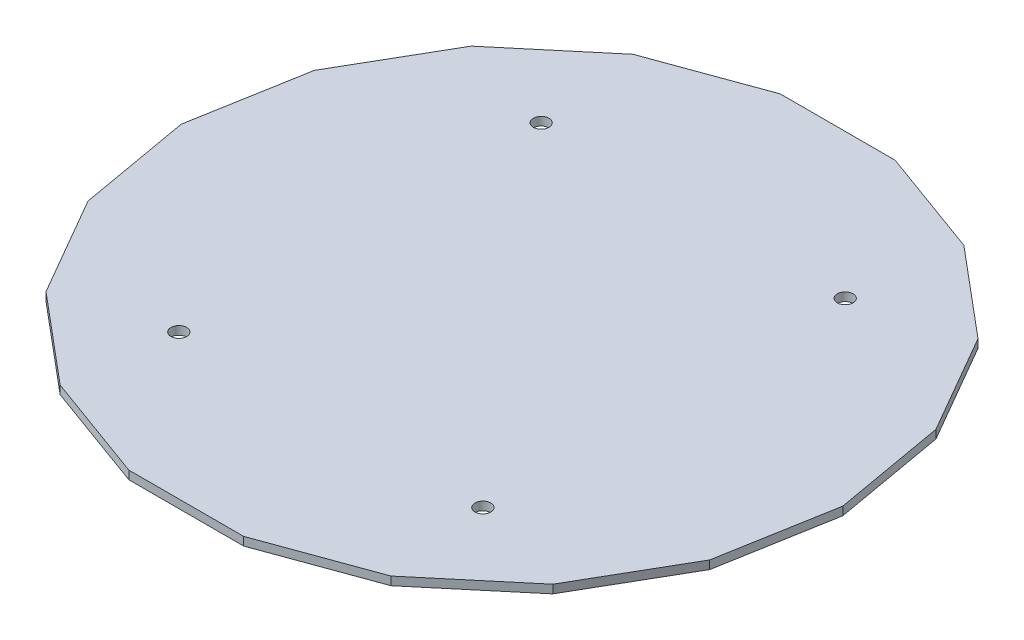
ISO-10303-21;
HEADER;
FILE_DESCRIPTION(('STEP AP214'),'2;1');
FILE_NAME('part.step','',(''),(''),'','','');
FILE_SCHEMA(('AUTOMOTIVE_DESIGN { 1 0 10303 214 1 1 1 1 }'));
ENDSEC;
DATA;
#1=APPLICATION_CONTEXT('core data for automotive mechanical design processes');
#2=APPLICATION_PROTOCOL_DEFINITION('international standard','automotive_design',2000,#1);
#3=PRODUCT_CONTEXT('',#1,'mechanical');
#4=PRODUCT('Part','Part','',(#3));
#5=PRODUCT_RELATED_PRODUCT_CATEGORY('part','',(#4));
#6=PRODUCT_DEFINITION_FORMATION('','',#4);
#7=PRODUCT_DEFINITION_CONTEXT('part definition',#1,'design');
#8=PRODUCT_DEFINITION('design','',#6,#7);
#9=PRODUCT_DEFINITION_SHAPE('','',#8);
#10=(LENGTH_UNIT() NAMED_UNIT(*) SI_UNIT(.MILLI.,.METRE.));
#11=(NAMED_UNIT(*) PLANE_ANGLE_UNIT() SI_UNIT($,.RADIAN.));
#12=(NAMED_UNIT(*) SI_UNIT($,.STERADIAN.) SOLID_ANGLE_UNIT());
#13=UNCERTAINTY_MEASURE_WITH_UNIT(LENGTH_MEASURE(1.E-05),#10,'distance_accuracy_value','');
#14=(GEOMETRIC_REPRESENTATION_CONTEXT(3) GLOBAL_UNCERTAINTY_ASSIGNED_CONTEXT((#13)) GLOBAL_UNIT_ASSIGNED_CONTEXT((#10,
#11,#12)) REPRESENTATION_CONTEXT('',''));
#15=CARTESIAN_POINT('',(0.,0.,0.));
#16=DIRECTION('',(0.,0.,1.));
#17=DIRECTION('',(1.,0.,0.));
#18=AXIS2_PLACEMENT_3D('',#15,#16,#17);
#19=CARTESIAN_POINT('',(59.2006351095123,1.6,21.547269029517));
#20=DIRECTION('',(-0.984807753012208,0.,-0.173648177666929));
#21=DIRECTION('',(-0.173648177666929,0.,0.984807753012208));
#22=AXIS2_PLACEMENT_3D('',#19,#20,#21);
#23=PLANE('',#22);
#24=DIRECTION('',(0.173648177666929,0.,-0.984807753012208));
#25=VECTOR('',#24,1.);
#26=CARTESIAN_POINT('',(59.2006351095123,0.,21.547269029517));
#27=LINE('',#26,#25);
#28=CARTESIAN_POINT('',(59.2006351095123,0.,21.547269029517));
#29=VERTEX_POINT('',#28);
#30=CARTESIAN_POINT('',(63.,0.,0.));
#31=VERTEX_POINT('',#30);
#32=EDGE_CURVE('E202',#29,#31,#27,.T.);
#33=ORIENTED_EDGE('',*,*,#32,.T.);
#34=DIRECTION('',(0.,-1.,0.));
#35=VECTOR('',#34,1.);
#36=CARTESIAN_POINT('',(63.,1.6,0.));
#37=LINE('',#36,#35);
#38=CARTESIAN_POINT('',(63.,1.6,0.));
#39=VERTEX_POINT('',#38);
#40=EDGE_CURVE('E11',#39,#31,#37,.T.);
#41=ORIENTED_EDGE('',*,*,#40,.F.);
#42=DIRECTION('',(0.173648177666929,0.,-0.984807753012208));
#43=VECTOR('',#42,1.);
#44=CARTESIAN_POINT('',(59.2006351095123,1.6,21.547269029517));
#45=LINE('',#44,#43);
#46=CARTESIAN_POINT('',(59.2006351095123,1.6,21.547269029517));
#47=VERTEX_POINT('',#46);
#48=EDGE_CURVE('E237',#47,#39,#45,.T.);
#49=ORIENTED_EDGE('',*,*,#48,.F.);
#50=DIRECTION('',(0.,-1.,0.));
#51=VECTOR('',#50,1.);
#52=CARTESIAN_POINT('',(59.2006351095123,1.6,21.547269029517));
#53=LINE('',#52,#51);
#54=EDGE_CURVE('E198',#47,#29,#53,.T.);
#55=ORIENTED_EDGE('',*,*,#54,.T.);
#56=EDGE_LOOP('',(#33,#41,#49,#55));
#57=FACE_BOUND('',#56,.T.);
#58=ADVANCED_FACE('F46',(#57),#23,.F.);
#59=CARTESIAN_POINT('',(63.,1.6,0.));
#60=DIRECTION('',(-0.984807753012208,0.,0.173648177666932));
#61=DIRECTION('',(0.173648177666932,0.,0.984807753012208));
#62=AXIS2_PLACEMENT_3D('',#59,#60,#61);
#63=PLANE('',#62);
#64=DIRECTION('',(-0.173648177666932,0.,-0.984807753012208));
#65=VECTOR('',#64,1.);
#66=CARTESIAN_POINT('',(63.,0.,0.));
#67=LINE('',#66,#65);
#68=CARTESIAN_POINT('',(59.2006351095122,0.,-21.5472690295172));
#69=VERTEX_POINT('',#68);
#70=EDGE_CURVE('E205',#31,#69,#67,.T.);
#71=ORIENTED_EDGE('',*,*,#70,.T.);
#72=DIRECTION('',(0.,-1.,0.));
#73=VECTOR('',#72,1.);
#74=CARTESIAN_POINT('',(59.2006351095122,1.6,-21.5472690295172));
#75=LINE('',#74,#73);
#76=CARTESIAN_POINT('',(59.2006351095122,1.6,-21.5472690295172));
#77=VERTEX_POINT('',#76);
#78=EDGE_CURVE('E54',#77,#69,#75,.T.);
#79=ORIENTED_EDGE('',*,*,#78,.F.);
#80=DIRECTION('',(-0.173648177666932,0.,-0.984807753012208));
#81=VECTOR('',#80,1.);
#82=CARTESIAN_POINT('',(63.,1.6,0.));
#83=LINE('',#82,#81);
#84=EDGE_CURVE('E135',#39,#77,#83,.T.);
#85=ORIENTED_EDGE('',*,*,#84,.F.);
#86=ORIENTED_EDGE('',*,*,#40,.T.);
#87=EDGE_LOOP('',(#71,#79,#85,#86));
#88=FACE_BOUND('',#87,.T.);
#89=ADVANCED_FACE('F346',(#88),#63,.F.);
#90=CARTESIAN_POINT('',(59.2006351095122,1.6,-21.5472690295172));
#91=DIRECTION('',(-0.866025403784437,0.,0.500000000000002));
#92=DIRECTION('',(0.500000000000002,0.,0.866025403784438));
#93=AXIS2_PLACEMENT_3D('',#90,#91,#92);
#94=PLANE('',#93);
#95=DIRECTION('',(-0.500000000000002,0.,-0.866025403784437));
#96=VECTOR('',#95,1.);
#97=CARTESIAN_POINT('',(59.2006351095122,0.,-21.5472690295172));
#98=LINE('',#97,#96);
#99=CARTESIAN_POINT('',(48.2607999164955,0.,-40.4956194102521));
#100=VERTEX_POINT('',#99);
#101=EDGE_CURVE('E208',#69,#100,#98,.T.);
#102=ORIENTED_EDGE('',*,*,#101,.T.);
#103=DIRECTION('',(0.,-1.,0.));
#104=VECTOR('',#103,1.);
#105=CARTESIAN_POINT('',(48.2607999164955,1.6,-40.4956194102521));
#106=LINE('',#105,#104);
#107=CARTESIAN_POINT('',(48.2607999164955,1.6,-40.4956194102521));
#108=VERTEX_POINT('',#107);
#109=EDGE_CURVE('E274',#108,#100,#106,.T.);
#110=ORIENTED_EDGE('',*,*,#109,.F.);
#111=DIRECTION('',(-0.500000000000002,0.,-0.866025403784437));
#112=VECTOR('',#111,1.);
#113=CARTESIAN_POINT('',(59.2006351095122,1.6,-21.5472690295172));
#114=LINE('',#113,#112);
#115=EDGE_CURVE('E282',#77,#108,#114,.T.);
#116=ORIENTED_EDGE('',*,*,#115,.F.);
#117=ORIENTED_EDGE('',*,*,#78,.T.);
#118=EDGE_LOOP('',(#102,#110,#116,#117));
#119=FACE_BOUND('',#118,.T.);
#120=ADVANCED_FACE('F280',(#119),#94,.F.);
#121=CARTESIAN_POINT('',(48.2607999164955,1.6,-40.4956194102521));
#122=DIRECTION('',(-0.642787609686538,0.,0.766044443118979));
#123=DIRECTION('',(0.766044443118979,0.,0.642787609686538));
#124=AXIS2_PLACEMENT_3D('',#121,#122,#123);
#125=PLANE('',#124);
#126=DIRECTION('',(-0.766044443118979,0.,-0.642787609686538));
#127=VECTOR('',#126,1.);
#128=CARTESIAN_POINT('',(48.2607999164955,0.,-40.4956194102521));
#129=LINE('',#128,#127);
#130=CARTESIAN_POINT('',(31.4999999999998,0.,-54.5596004384197));
#131=VERTEX_POINT('',#130);
#132=EDGE_CURVE('E210',#100,#131,#129,.T.);
#133=ORIENTED_EDGE('',*,*,#132,.T.);
#134=DIRECTION('',(0.,-1.,0.));
#135=VECTOR('',#134,1.);
#136=CARTESIAN_POINT('',(31.4999999999998,1.6,-54.5596004384197));
#137=LINE('',#136,#135);
#138=CARTESIAN_POINT('',(31.4999999999998,1.6,-54.5596004384197));
#139=VERTEX_POINT('',#138);
#140=EDGE_CURVE('E271',#139,#131,#137,.T.);
#141=ORIENTED_EDGE('',*,*,#140,.F.);
#142=DIRECTION('',(-0.766044443118979,0.,-0.642787609686538));
#143=VECTOR('',#142,1.);
#144=CARTESIAN_POINT('',(48.2607999164955,1.6,-40.4956194102521));
#145=LINE('',#144,#143);
#146=EDGE_CURVE('E300',#108,#139,#145,.T.);
#147=ORIENTED_EDGE('',*,*,#146,.F.);
#148=ORIENTED_EDGE('',*,*,#109,.T.);
#149=EDGE_LOOP('',(#133,#141,#147,#148));
#150=FACE_BOUND('',#149,.T.);
#151=ADVANCED_FACE('F291',(#150),#125,.F.);
#152=CARTESIAN_POINT('',(31.4999999999998,1.6,-54.5596004384197));
#153=DIRECTION('',(-0.342020143325667,0.,0.939692620785909));
#154=DIRECTION('',(0.939692620785909,0.,0.342020143325667));
#155=AXIS2_PLACEMENT_3D('',#152,#153,#154);
#156=PLANE('',#155);
#157=DIRECTION('',(-0.939692620785909,0.,-0.342020143325667));
#158=VECTOR('',#157,1.);
#159=CARTESIAN_POINT('',(31.4999999999998,0.,-54.5596004384197));
#160=LINE('',#159,#158);
#161=CARTESIAN_POINT('',(10.9398351930166,0.,-62.0428884397691));
#162=VERTEX_POINT('',#161);
#163=EDGE_CURVE('E212',#131,#162,#160,.T.);
#164=ORIENTED_EDGE('',*,*,#163,.T.);
#165=DIRECTION('',(0.,-1.,0.));
#166=VECTOR('',#165,1.);
#167=CARTESIAN_POINT('',(10.9398351930166,1.6,-62.0428884397691));
#168=LINE('',#167,#166);
#169=CARTESIAN_POINT('',(10.9398351930166,1.6,-62.0428884397691));
#170=VERTEX_POINT('',#169);
#171=EDGE_CURVE('E268',#170,#162,#168,.T.);
#172=ORIENTED_EDGE('',*,*,#171,.F.);
#173=DIRECTION('',(-0.939692620785909,0.,-0.342020143325667));
#174=VECTOR('',#173,1.);
#175=CARTESIAN_POINT('',(31.4999999999998,1.6,-54.5596004384197));
#176=LINE('',#175,#174);
#177=EDGE_CURVE('E297',#139,#170,#176,.T.);
#178=ORIENTED_EDGE('',*,*,#177,.F.);
#179=ORIENTED_EDGE('',*,*,#140,.T.);
#180=EDGE_LOOP('',(#164,#172,#178,#179));
#181=FACE_BOUND('',#180,.T.);
#182=ADVANCED_FACE('F295',(#181),#156,.F.);
#183=CARTESIAN_POINT('',(10.9398351930166,1.6,-62.0428884397691));
#184=DIRECTION('',(0.,0.,1.));
#185=DIRECTION('',(1.,0.,0.));
#186=AXIS2_PLACEMENT_3D('',#183,#184,#185);
#187=PLANE('',#186);
#188=DIRECTION('',(-1.,0.,0.));
#189=VECTOR('',#188,1.);
#190=CARTESIAN_POINT('',(10.9398351930166,0.,-62.0428884397691));
#191=LINE('',#190,#189);
#192=CARTESIAN_POINT('',(-10.9398351930167,0.,-62.0428884397691));
#193=VERTEX_POINT('',#192);
#194=EDGE_CURVE('E214',#162,#193,#191,.T.);
#195=ORIENTED_EDGE('',*,*,#194,.T.);
#196=DIRECTION('',(0.,-1.,0.));
#197=VECTOR('',#196,1.);
#198=CARTESIAN_POINT('',(-10.9398351930167,1.6,-62.0428884397691));
#199=LINE('',#198,#197);
#200=CARTESIAN_POINT('',(-10.9398351930167,1.6,-62.0428884397691));
#201=VERTEX_POINT('',#200);
#202=EDGE_CURVE('E265',#201,#193,#199,.T.);
#203=ORIENTED_EDGE('',*,*,#202,.F.);
#204=DIRECTION('',(-1.,0.,0.));
#205=VECTOR('',#204,1.);
#206=CARTESIAN_POINT('',(10.9398351930166,1.6,-62.0428884397691));
#207=LINE('',#206,#205);
#208=EDGE_CURVE('E299',#170,#201,#207,.T.);
#209=ORIENTED_EDGE('',*,*,#208,.F.);
#210=ORIENTED_EDGE('',*,*,#171,.T.);
#211=EDGE_LOOP('',(#195,#203,#209,#210));
#212=FACE_BOUND('',#211,.T.);
#213=ADVANCED_FACE('F359',(#212),#187,.F.);
#214=CARTESIAN_POINT('',(-10.9398351930167,1.6,-62.0428884397691));
#215=DIRECTION('',(0.342020143325671,0.,0.939692620785908));
#216=DIRECTION('',(0.939692620785908,0.,-0.342020143325671));
#217=AXIS2_PLACEMENT_3D('',#214,#215,#216);
#218=PLANE('',#217);
#219=DIRECTION('',(-0.939692620785908,0.,0.342020143325671));
#220=VECTOR('',#219,1.);
#221=CARTESIAN_POINT('',(-10.9398351930167,0.,-62.0428884397691));
#222=LINE('',#221,#220);
#223=CARTESIAN_POINT('',(-31.5000000000001,0.,-54.5596004384196));
#224=VERTEX_POINT('',#223);
#225=EDGE_CURVE('E216',#193,#224,#222,.T.);
#226=ORIENTED_EDGE('',*,*,#225,.T.);
#227=DIRECTION('',(0.,-1.,0.));
#228=VECTOR('',#227,1.);
#229=CARTESIAN_POINT('',(-31.5000000000001,1.6,-54.5596004384196));
#230=LINE('',#229,#228);
#231=CARTESIAN_POINT('',(-31.5000000000001,1.6,-54.5596004384196));
#232=VERTEX_POINT('',#231);
#233=EDGE_CURVE('E262',#232,#224,#230,.T.);
#234=ORIENTED_EDGE('',*,*,#233,.F.);
#235=DIRECTION('',(-0.939692620785908,0.,0.342020143325671));
#236=VECTOR('',#235,1.);
#237=CARTESIAN_POINT('',(-10.9398351930167,1.6,-62.0428884397691));
#238=LINE('',#237,#236);
#239=EDGE_CURVE('E302',#201,#232,#238,.T.);
#240=ORIENTED_EDGE('',*,*,#239,.F.);
#241=ORIENTED_EDGE('',*,*,#202,.T.);
#242=EDGE_LOOP('',(#226,#234,#240,#241));
#243=FACE_BOUND('',#242,.T.);
#244=ADVANCED_FACE('F362',(#243),#218,.F.);
#245=CARTESIAN_POINT('',(-31.5000000000001,1.6,-54.5596004384196));
#246=DIRECTION('',(0.642787609686541,0.,0.766044443118977));
#247=DIRECTION('',(0.766044443118977,0.,-0.642787609686541));
#248=AXIS2_PLACEMENT_3D('',#245,#246,#247);
#249=PLANE('',#248);
#250=DIRECTION('',(-0.766044443118977,0.,0.642787609686541));
#251=VECTOR('',#250,1.);
#252=CARTESIAN_POINT('',(-31.5000000000001,0.,-54.5596004384196));
#253=LINE('',#252,#251);
#254=CARTESIAN_POINT('',(-48.2607999164957,0.,-40.4956194102519));
#255=VERTEX_POINT('',#254);
#256=EDGE_CURVE('E218',#224,#255,#253,.T.);
#257=ORIENTED_EDGE('',*,*,#256,.T.);
#258=DIRECTION('',(0.,-1.,0.));
#259=VECTOR('',#258,1.);
#260=CARTESIAN_POINT('',(-48.2607999164957,1.6,-40.4956194102519));
#261=LINE('',#260,#259);
#262=CARTESIAN_POINT('',(-48.2607999164957,1.6,-40.4956194102519));
#263=VERTEX_POINT('',#262);
#264=EDGE_CURVE('E259',#263,#255,#261,.T.);
#265=ORIENTED_EDGE('',*,*,#264,.F.);
#266=DIRECTION('',(-0.766044443118977,0.,0.642787609686541));
#267=VECTOR('',#266,1.);
#268=CARTESIAN_POINT('',(-31.5000000000001,1.6,-54.5596004384196));
#269=LINE('',#268,#267);
#270=EDGE_CURVE('E308',#232,#263,#269,.T.);
#271=ORIENTED_EDGE('',*,*,#270,.F.);
#272=ORIENTED_EDGE('',*,*,#233,.T.);
#273=EDGE_LOOP('',(#257,#265,#271,#272));
#274=FACE_BOUND('',#273,.T.);
#275=ADVANCED_FACE('F366',(#274),#249,.F.);
#276=CARTESIAN_POINT('',(-48.2607999164957,1.6,-40.4956194102519));
#277=DIRECTION('',(0.86602540378444,0.,0.499999999999998));
#278=DIRECTION('',(0.499999999999998,0.,-0.86602540378444));
#279=AXIS2_PLACEMENT_3D('',#276,#277,#278);
#280=PLANE('',#279);
#281=DIRECTION('',(-0.499999999999998,0.,0.86602540378444));
#282=VECTOR('',#281,1.);
#283=CARTESIAN_POINT('',(-48.2607999164957,0.,-40.4956194102519));
#284=LINE('',#283,#282);
#285=CARTESIAN_POINT('',(-59.2006351095123,0.,-21.547269029517));
#286=VERTEX_POINT('',#285);
#287=EDGE_CURVE('E220',#255,#286,#284,.T.);
#288=ORIENTED_EDGE('',*,*,#287,.T.);
#289=DIRECTION('',(0.,-1.,0.));
#290=VECTOR('',#289,1.);
#291=CARTESIAN_POINT('',(-59.2006351095123,1.6,-21.547269029517));
#292=LINE('',#291,#290);
#293=CARTESIAN_POINT('',(-59.2006351095123,1.6,-21.547269029517));
#294=VERTEX_POINT('',#293);
#295=EDGE_CURVE('E256',#294,#286,#292,.T.);
#296=ORIENTED_EDGE('',*,*,#295,.F.);
#297=DIRECTION('',(-0.499999999999998,0.,0.86602540378444));
#298=VECTOR('',#297,1.);
#299=CARTESIAN_POINT('',(-48.2607999164957,1.6,-40.4956194102519));
#300=LINE('',#299,#298);
#301=EDGE_CURVE('E310',#263,#294,#300,.T.);
#302=ORIENTED_EDGE('',*,*,#301,.F.);
#303=ORIENTED_EDGE('',*,*,#264,.T.);
#304=EDGE_LOOP('',(#288,#296,#302,#303));
#305=FACE_BOUND('',#304,.T.);
#306=ADVANCED_FACE('F370',(#305),#280,.F.);
#307=CARTESIAN_POINT('',(-59.2006351095123,1.6,-21.547269029517));
#308=DIRECTION('',(0.984807753012208,0.,0.173648177666929));
#309=DIRECTION('',(0.173648177666929,0.,-0.984807753012208));
#310=AXIS2_PLACEMENT_3D('',#307,#308,#309);
#311=PLANE('',#310);
#312=DIRECTION('',(-0.173648177666929,0.,0.984807753012208));
#313=VECTOR('',#312,1.);
#314=CARTESIAN_POINT('',(-59.2006351095123,0.,-21.547269029517));
#315=LINE('',#314,#313);
#316=CARTESIAN_POINT('',(-63.,0.,0.));
#317=VERTEX_POINT('',#316);
#318=EDGE_CURVE('E222',#286,#317,#315,.T.);
#319=ORIENTED_EDGE('',*,*,#318,.T.);
#320=DIRECTION('',(0.,-1.,0.));
#321=VECTOR('',#320,1.);
#322=CARTESIAN_POINT('',(-63.,1.6,0.));
#323=LINE('',#322,#321);
#324=CARTESIAN_POINT('',(-63.,1.6,0.));
#325=VERTEX_POINT('',#324);
#326=EDGE_CURVE('E253',#325,#317,#323,.T.);
#327=ORIENTED_EDGE('',*,*,#326,.F.);
#328=DIRECTION('',(-0.173648177666929,0.,0.984807753012208));
#329=VECTOR('',#328,1.);
#330=CARTESIAN_POINT('',(-59.2006351095123,1.6,-21.547269029517));
#331=LINE('',#330,#329);
#332=EDGE_CURVE('E312',#294,#325,#331,.T.);
#333=ORIENTED_EDGE('',*,*,#332,.F.);
#334=ORIENTED_EDGE('',*,*,#295,.T.);
#335=EDGE_LOOP('',(#319,#327,#333,#334));
#336=FACE_BOUND('',#335,.T.);
#337=ADVANCED_FACE('F374',(#336),#311,.F.);
#338=CARTESIAN_POINT('',(-63.,1.6,0.));
#339=DIRECTION('',(0.984807753012208,0.,-0.173648177666932));
#340=DIRECTION('',(-0.173648177666932,0.,-0.984807753012208));
#341=AXIS2_PLACEMENT_3D('',#338,#339,#340);
#342=PLANE('',#341);
#343=DIRECTION('',(0.173648177666932,0.,0.984807753012208));
#344=VECTOR('',#343,1.);
#345=CARTESIAN_POINT('',(-63.,0.,0.));
#346=LINE('',#345,#344);
#347=CARTESIAN_POINT('',(-59.2006351095122,0.,21.5472690295173));
#348=VERTEX_POINT('',#347);
#349=EDGE_CURVE('E224',#317,#348,#346,.T.);
#350=ORIENTED_EDGE('',*,*,#349,.T.);
#351=DIRECTION('',(0.,-1.,0.));
#352=VECTOR('',#351,1.);
#353=CARTESIAN_POINT('',(-59.2006351095122,1.6,21.5472690295173));
#354=LINE('',#353,#352);
#355=CARTESIAN_POINT('',(-59.2006351095122,1.6,21.5472690295173));
#356=VERTEX_POINT('',#355);
#357=EDGE_CURVE('E250',#356,#348,#354,.T.);
#358=ORIENTED_EDGE('',*,*,#357,.F.);
#359=DIRECTION('',(0.173648177666932,0.,0.984807753012208));
#360=VECTOR('',#359,1.);
#361=CARTESIAN_POINT('',(-63.,1.6,0.));
#362=LINE('',#361,#360);
#363=EDGE_CURVE('E314',#325,#356,#362,.T.);
#364=ORIENTED_EDGE('',*,*,#363,.F.);
#365=ORIENTED_EDGE('',*,*,#326,.T.);
#366=EDGE_LOOP('',(#350,#358,#364,#365));
#367=FACE_BOUND('',#366,.T.);
#368=ADVANCED_FACE('F378',(#367),#342,.F.);
#369=CARTESIAN_POINT('',(-59.2006351095122,1.6,21.5472690295173));
#370=DIRECTION('',(0.866025403784438,0.,-0.500000000000002));
#371=DIRECTION('',(-0.500000000000002,0.,-0.866025403784438));
#372=AXIS2_PLACEMENT_3D('',#369,#370,#371);
#373=PLANE('',#372);
#374=DIRECTION('',(0.500000000000002,0.,0.866025403784438));
#375=VECTOR('',#374,1.);
#376=CARTESIAN_POINT('',(-59.2006351095122,0.,21.5472690295173));
#377=LINE('',#376,#375);
#378=CARTESIAN_POINT('',(-48.2607999164956,0.,40.4956194102521));
#379=VERTEX_POINT('',#378);
#380=EDGE_CURVE('E226',#348,#379,#377,.T.);
#381=ORIENTED_EDGE('',*,*,#380,.T.);
#382=DIRECTION('',(0.,-1.,0.));
#383=VECTOR('',#382,1.);
#384=CARTESIAN_POINT('',(-48.2607999164956,1.6,40.4956194102521));
#385=LINE('',#384,#383);
#386=CARTESIAN_POINT('',(-48.2607999164956,1.6,40.4956194102521));
#387=VERTEX_POINT('',#386);
#388=EDGE_CURVE('E247',#387,#379,#385,.T.);
#389=ORIENTED_EDGE('',*,*,#388,.F.);
#390=DIRECTION('',(0.500000000000002,0.,0.866025403784438));
#391=VECTOR('',#390,1.);
#392=CARTESIAN_POINT('',(-59.2006351095122,1.6,21.5472690295173));
#393=LINE('',#392,#391);
#394=EDGE_CURVE('E316',#356,#387,#393,.T.);
#395=ORIENTED_EDGE('',*,*,#394,.F.);
#396=ORIENTED_EDGE('',*,*,#357,.T.);
#397=EDGE_LOOP('',(#381,#389,#395,#396));
#398=FACE_BOUND('',#397,.T.);
#399=ADVANCED_FACE('F382',(#398),#373,.F.);
#400=CARTESIAN_POINT('',(-48.2607999164956,1.6,40.4956194102521));
#401=DIRECTION('',(0.642787609686538,0.,-0.766044443118979));
#402=DIRECTION('',(-0.766044443118979,0.,-0.642787609686538));
#403=AXIS2_PLACEMENT_3D('',#400,#401,#402);
#404=PLANE('',#403);
#405=DIRECTION('',(0.766044443118979,0.,0.642787609686538));
#406=VECTOR('',#405,1.);
#407=CARTESIAN_POINT('',(-48.2607999164956,0.,40.4956194102521));
#408=LINE('',#407,#406);
#409=CARTESIAN_POINT('',(-31.4999999999999,0.,54.5596004384197));
#410=VERTEX_POINT('',#409);
#411=EDGE_CURVE('E228',#379,#410,#408,.T.);
#412=ORIENTED_EDGE('',*,*,#411,.T.);
#413=DIRECTION('',(0.,-1.,0.));
#414=VECTOR('',#413,1.);
#415=CARTESIAN_POINT('',(-31.4999999999999,1.6,54.5596004384197));
#416=LINE('',#415,#414);
#417=CARTESIAN_POINT('',(-31.4999999999999,1.6,54.5596004384197));
#418=VERTEX_POINT('',#417);
#419=EDGE_CURVE('E244',#418,#410,#416,.T.);
#420=ORIENTED_EDGE('',*,*,#419,.F.);
#421=DIRECTION('',(0.766044443118979,0.,0.642787609686538));
#422=VECTOR('',#421,1.);
#423=CARTESIAN_POINT('',(-48.2607999164956,1.6,40.4956194102521));
#424=LINE('',#423,#422);
#425=EDGE_CURVE('E318',#387,#418,#424,.T.);
#426=ORIENTED_EDGE('',*,*,#425,.F.);
#427=ORIENTED_EDGE('',*,*,#388,.T.);
#428=EDGE_LOOP('',(#412,#420,#426,#427));
#429=FACE_BOUND('',#428,.T.);
#430=ADVANCED_FACE('F386',(#429),#404,.F.);
#431=CARTESIAN_POINT('',(-31.4999999999999,1.6,54.5596004384197));
#432=DIRECTION('',(0.342020143325667,0.,-0.939692620785909));
#433=DIRECTION('',(-0.939692620785909,0.,-0.342020143325667));
#434=AXIS2_PLACEMENT_3D('',#431,#432,#433);
#435=PLANE('',#434);
#436=DIRECTION('',(0.939692620785909,0.,0.342020143325667));
#437=VECTOR('',#436,1.);
#438=CARTESIAN_POINT('',(-31.4999999999999,0.,54.5596004384197));
#439=LINE('',#438,#437);
#440=CARTESIAN_POINT('',(-10.9398351930165,0.,62.0428884397691));
#441=VERTEX_POINT('',#440);
#442=EDGE_CURVE('E230',#410,#441,#439,.T.);
#443=ORIENTED_EDGE('',*,*,#442,.T.);
#444=DIRECTION('',(0.,-1.,0.));
#445=VECTOR('',#444,1.);
#446=CARTESIAN_POINT('',(-10.9398351930165,1.6,62.0428884397691));
#447=LINE('',#446,#445);
#448=CARTESIAN_POINT('',(-10.9398351930165,1.6,62.0428884397691));
#449=VERTEX_POINT('',#448);
#450=EDGE_CURVE('E241',#449,#441,#447,.T.);
#451=ORIENTED_EDGE('',*,*,#450,.F.);
#452=DIRECTION('',(0.939692620785909,0.,0.342020143325667));
#453=VECTOR('',#452,1.);
#454=CARTESIAN_POINT('',(-31.4999999999999,1.6,54.5596004384197));
#455=LINE('',#454,#453);
#456=EDGE_CURVE('E320',#418,#449,#455,.T.);
#457=ORIENTED_EDGE('',*,*,#456,.F.);
#458=ORIENTED_EDGE('',*,*,#419,.T.);
#459=EDGE_LOOP('',(#443,#451,#457,#458));
#460=FACE_BOUND('',#459,.T.);
#461=ADVANCED_FACE('F326',(#460),#435,.F.);
#462=CARTESIAN_POINT('',(-10.9398351930165,1.6,62.0428884397691));
#463=DIRECTION('',(0.,0.,-1.));
#464=DIRECTION('',(-1.,0.,0.));
#465=AXIS2_PLACEMENT_3D('',#462,#463,#464);
#466=PLANE('',#465);
#467=DIRECTION('',(1.,0.,0.));
#468=VECTOR('',#467,1.);
#469=CARTESIAN_POINT('',(-10.9398351930165,0.,62.0428884397691));
#470=LINE('',#469,#468);
#471=CARTESIAN_POINT('',(10.9398351930167,0.,62.0428884397691));
#472=VERTEX_POINT('',#471);
#473=EDGE_CURVE('E232',#441,#472,#470,.T.);
#474=ORIENTED_EDGE('',*,*,#473,.T.);
#475=DIRECTION('',(0.,-1.,0.));
#476=VECTOR('',#475,1.);
#477=CARTESIAN_POINT('',(10.9398351930167,1.6,62.0428884397691));
#478=LINE('',#477,#476);
#479=CARTESIAN_POINT('',(10.9398351930167,1.6,62.0428884397691));
#480=VERTEX_POINT('',#479);
#481=EDGE_CURVE('E193',#480,#472,#478,.T.);
#482=ORIENTED_EDGE('',*,*,#481,.F.);
#483=DIRECTION('',(1.,0.,0.));
#484=VECTOR('',#483,1.);
#485=CARTESIAN_POINT('',(-10.9398351930165,1.6,62.0428884397691));
#486=LINE('',#485,#484);
#487=EDGE_CURVE('E184',#449,#480,#486,.T.);
#488=ORIENTED_EDGE('',*,*,#487,.F.);
#489=ORIENTED_EDGE('',*,*,#450,.T.);
#490=EDGE_LOOP('',(#474,#482,#488,#489));
#491=FACE_BOUND('',#490,.T.);
#492=ADVANCED_FACE('F330',(#491),#466,.F.);
#493=CARTESIAN_POINT('',(10.9398351930167,1.6,62.0428884397691));
#494=DIRECTION('',(-0.34202014332567,0.,-0.939692620785908));
#495=DIRECTION('',(-0.939692620785908,0.,0.34202014332567));
#496=AXIS2_PLACEMENT_3D('',#493,#494,#495);
#497=PLANE('',#496);
#498=DIRECTION('',(0.939692620785908,0.,-0.34202014332567));
#499=VECTOR('',#498,1.);
#500=CARTESIAN_POINT('',(10.9398351930167,0.,62.0428884397691));
#501=LINE('',#500,#499);
#502=CARTESIAN_POINT('',(31.5000000000001,0.,54.5596004384196));
#503=VERTEX_POINT('',#502);
#504=EDGE_CURVE('E192',#472,#503,#501,.T.);
#505=ORIENTED_EDGE('',*,*,#504,.T.);
#506=DIRECTION('',(0.,-1.,0.));
#507=VECTOR('',#506,1.);
#508=CARTESIAN_POINT('',(31.5000000000001,1.6,54.5596004384196));
#509=LINE('',#508,#507);
#510=CARTESIAN_POINT('',(31.5000000000001,1.6,54.5596004384196));
#511=VERTEX_POINT('',#510);
#512=EDGE_CURVE('E189',#511,#503,#509,.T.);
#513=ORIENTED_EDGE('',*,*,#512,.F.);
#514=DIRECTION('',(0.939692620785908,0.,-0.34202014332567));
#515=VECTOR('',#514,1.);
#516=CARTESIAN_POINT('',(10.9398351930167,1.6,62.0428884397691));
#517=LINE('',#516,#515);
#518=EDGE_CURVE('E178',#480,#511,#517,.T.);
#519=ORIENTED_EDGE('',*,*,#518,.F.);
#520=ORIENTED_EDGE('',*,*,#481,.T.);
#521=EDGE_LOOP('',(#505,#513,#519,#520));
#522=FACE_BOUND('',#521,.T.);
#523=ADVANCED_FACE('F190',(#522),#497,.F.);
#524=CARTESIAN_POINT('',(31.5000000000001,1.6,54.5596004384196));
#525=DIRECTION('',(-0.642787609686541,0.,-0.766044443118976));
#526=DIRECTION('',(-0.766044443118977,0.,0.642787609686541));
#527=AXIS2_PLACEMENT_3D('',#524,#525,#526);
#528=PLANE('',#527);
#529=DIRECTION('',(0.766044443118977,0.,-0.642787609686541));
#530=VECTOR('',#529,1.);
#531=CARTESIAN_POINT('',(31.5000000000001,0.,54.5596004384196));
#532=LINE('',#531,#530);
#533=CARTESIAN_POINT('',(48.2607999164957,0.,40.4956194102519));
#534=VERTEX_POINT('',#533);
#535=EDGE_CURVE('E121',#503,#534,#532,.T.);
#536=ORIENTED_EDGE('',*,*,#535,.T.);
#537=DIRECTION('',(0.,-1.,0.));
#538=VECTOR('',#537,1.);
#539=CARTESIAN_POINT('',(48.2607999164957,1.6,40.4956194102519));
#540=LINE('',#539,#538);
#541=CARTESIAN_POINT('',(48.2607999164957,1.6,40.4956194102519));
#542=VERTEX_POINT('',#541);
#543=EDGE_CURVE('E194',#542,#534,#540,.T.);
#544=ORIENTED_EDGE('',*,*,#543,.F.);
#545=DIRECTION('',(0.766044443118977,0.,-0.642787609686541));
#546=VECTOR('',#545,1.);
#547=CARTESIAN_POINT('',(31.5000000000001,1.6,54.5596004384196));
#548=LINE('',#547,#546);
#549=EDGE_CURVE('E182',#511,#542,#548,.T.);
#550=ORIENTED_EDGE('',*,*,#549,.F.);
#551=ORIENTED_EDGE('',*,*,#512,.T.);
#552=EDGE_LOOP('',(#536,#544,#550,#551));
#553=FACE_BOUND('',#552,.T.);
#554=ADVANCED_FACE('F196',(#553),#528,.F.);
#555=CARTESIAN_POINT('',(48.2607999164957,1.6,40.4956194102519));
#556=DIRECTION('',(-0.86602540378444,0.,-0.499999999999998));
#557=DIRECTION('',(-0.499999999999998,0.,0.86602540378444));
#558=AXIS2_PLACEMENT_3D('',#555,#556,#557);
#559=PLANE('',#558);
#560=DIRECTION('',(0.499999999999998,0.,-0.86602540378444));
#561=VECTOR('',#560,1.);
#562=CARTESIAN_POINT('',(48.2607999164957,0.,40.4956194102519));
#563=LINE('',#562,#561);
#564=EDGE_CURVE('E127',#534,#29,#563,.T.);
#565=ORIENTED_EDGE('',*,*,#564,.T.);
#566=ORIENTED_EDGE('',*,*,#54,.F.);
#567=DIRECTION('',(0.499999999999998,0.,-0.86602540378444));
#568=VECTOR('',#567,1.);
#569=CARTESIAN_POINT('',(48.2607999164957,1.6,40.4956194102519));
#570=LINE('',#569,#568);
#571=EDGE_CURVE('E62',#542,#47,#570,.T.);
#572=ORIENTED_EDGE('',*,*,#571,.F.);
#573=ORIENTED_EDGE('',*,*,#543,.T.);
#574=EDGE_LOOP('',(#565,#566,#572,#573));
#575=FACE_BOUND('',#574,.T.);
#576=ADVANCED_FACE('F334',(#575),#559,.F.);
#577=CARTESIAN_POINT('',(0.,1.6,0.));
#578=DIRECTION('',(0.,1.,0.));
#579=DIRECTION('',(0.,0.,1.));
#580=AXIS2_PLACEMENT_3D('',#577,#578,#579);
#581=PLANE('',#580);
#582=CARTESIAN_POINT('',(28.9530105935765,1.6,-34.5048543913133));
#583=DIRECTION('',(0.,1.,0.));
#584=DIRECTION('',(0.,0.,1.));
#585=AXIS2_PLACEMENT_3D('',#582,#583,#584);
#586=CIRCLE('',#585,1.5);
#587=CARTESIAN_POINT('',(28.9530105935765,1.6,-33.0048543913133));
#588=VERTEX_POINT('',#587);
#589=EDGE_CURVE('E656',#588,#588,#586,.T.);
#590=ORIENTED_EDGE('',*,*,#589,.F.);
#591=EDGE_LOOP('',(#590));
#592=FACE_BOUND('',#591,.T.);
#593=CARTESIAN_POINT('',(-28.9530105935765,1.6,34.5048543913133));
#594=DIRECTION('',(0.,1.,0.));
#595=DIRECTION('',(0.,0.,1.));
#596=AXIS2_PLACEMENT_3D('',#593,#594,#595);
#597=CIRCLE('',#596,1.5);
#598=CARTESIAN_POINT('',(-28.9530105935765,1.6,36.0048543913133));
#599=VERTEX_POINT('',#598);
#600=EDGE_CURVE('E661',#599,#599,#597,.T.);
#601=ORIENTED_EDGE('',*,*,#600,.F.);
#602=EDGE_LOOP('',(#601));
#603=FACE_BOUND('',#602,.T.);
#604=CARTESIAN_POINT('',(28.9530105935765,1.6,34.5048543913133));
#605=DIRECTION('',(0.,1.,0.));
#606=DIRECTION('',(0.,0.,1.));
#607=AXIS2_PLACEMENT_3D('',#604,#605,#606);
#608=CIRCLE('',#607,1.5);
#609=CARTESIAN_POINT('',(28.9530105935765,1.6,36.0048543913133));
#610=VERTEX_POINT('',#609);
#611=EDGE_CURVE('E668',#610,#610,#608,.T.);
#612=ORIENTED_EDGE('',*,*,#611,.F.);
#613=EDGE_LOOP('',(#612));
#614=FACE_BOUND('',#613,.T.);
#615=CARTESIAN_POINT('',(-28.9530105935767,1.6,-34.5048543913131));
#616=DIRECTION('',(0.,1.,0.));
#617=DIRECTION('',(0.,0.,1.));
#618=AXIS2_PLACEMENT_3D('',#615,#616,#617);
#619=CIRCLE('',#618,1.5);
#620=CARTESIAN_POINT('',(-28.9530105935767,1.6,-33.0048543913131));
#621=VERTEX_POINT('',#620);
#622=EDGE_CURVE('E657',#621,#621,#619,.T.);
#623=ORIENTED_EDGE('',*,*,#622,.F.);
#624=EDGE_LOOP('',(#623));
#625=FACE_BOUND('',#624,.T.);
#626=ORIENTED_EDGE('',*,*,#48,.T.);
#627=ORIENTED_EDGE('',*,*,#84,.T.);
#628=ORIENTED_EDGE('',*,*,#115,.T.);
#629=ORIENTED_EDGE('',*,*,#146,.T.);
#630=ORIENTED_EDGE('',*,*,#177,.T.);
#631=ORIENTED_EDGE('',*,*,#208,.T.);
#632=ORIENTED_EDGE('',*,*,#239,.T.);
#633=ORIENTED_EDGE('',*,*,#270,.T.);
#634=ORIENTED_EDGE('',*,*,#301,.T.);
#635=ORIENTED_EDGE('',*,*,#332,.T.);
#636=ORIENTED_EDGE('',*,*,#363,.T.);
#637=ORIENTED_EDGE('',*,*,#394,.T.);
#638=ORIENTED_EDGE('',*,*,#425,.T.);
#639=ORIENTED_EDGE('',*,*,#456,.T.);
#640=ORIENTED_EDGE('',*,*,#487,.T.);
#641=ORIENTED_EDGE('',*,*,#518,.T.);
#642=ORIENTED_EDGE('',*,*,#549,.T.);
#643=ORIENTED_EDGE('',*,*,#571,.T.);
#644=EDGE_LOOP('',(#626,#627,#628,#629,#630,#631,#632,#633,#634,#635,#636,#637,#638,#639,#640,
#641,#642,#643));
#645=FACE_BOUND('',#644,.T.);
#646=ADVANCED_FACE('F180',(#592,#603,#614,#625,#645),#581,.T.);
#647=CARTESIAN_POINT('',(0.,0.,0.));
#648=DIRECTION('',(0.,1.,0.));
#649=DIRECTION('',(0.,0.,1.));
#650=AXIS2_PLACEMENT_3D('',#647,#648,#649);
#651=PLANE('',#650);
#652=CARTESIAN_POINT('',(28.9530105935765,0.,-34.5048543913133));
#653=DIRECTION('',(0.,1.,0.));
#654=DIRECTION('',(0.,0.,1.));
#655=AXIS2_PLACEMENT_3D('',#652,#653,#654);
#656=CIRCLE('',#655,1.5);
#657=CARTESIAN_POINT('',(28.9530105935765,0.,-33.0048543913133));
#658=VERTEX_POINT('',#657);
#659=EDGE_CURVE('E653',#658,#658,#656,.F.);
#660=ORIENTED_EDGE('',*,*,#659,.F.);
#661=EDGE_LOOP('',(#660));
#662=FACE_BOUND('',#661,.T.);
#663=CARTESIAN_POINT('',(-28.9530105935765,0.,34.5048543913133));
#664=DIRECTION('',(0.,1.,0.));
#665=DIRECTION('',(0.,0.,1.));
#666=AXIS2_PLACEMENT_3D('',#663,#664,#665);
#667=CIRCLE('',#666,1.5);
#668=CARTESIAN_POINT('',(-28.9530105935765,0.,36.0048543913133));
#669=VERTEX_POINT('',#668);
#670=EDGE_CURVE('E665',#669,#669,#667,.F.);
#671=ORIENTED_EDGE('',*,*,#670,.F.);
#672=EDGE_LOOP('',(#671));
#673=FACE_BOUND('',#672,.T.);
#674=CARTESIAN_POINT('',(28.9530105935765,0.,34.5048543913133));
#675=DIRECTION('',(0.,1.,0.));
#676=DIRECTION('',(0.,0.,1.));
#677=AXIS2_PLACEMENT_3D('',#674,#675,#676);
#678=CIRCLE('',#677,1.5);
#679=CARTESIAN_POINT('',(28.9530105935765,0.,36.0048543913133));
#680=VERTEX_POINT('',#679);
#681=EDGE_CURVE('E686',#680,#680,#678,.F.);
#682=ORIENTED_EDGE('',*,*,#681,.F.);
#683=EDGE_LOOP('',(#682));
#684=FACE_BOUND('',#683,.T.);
#685=CARTESIAN_POINT('',(-28.9530105935767,0.,-34.5048543913131));
#686=DIRECTION('',(0.,1.,0.));
#687=DIRECTION('',(0.,0.,1.));
#688=AXIS2_PLACEMENT_3D('',#685,#686,#687);
#689=CIRCLE('',#688,1.5);
#690=CARTESIAN_POINT('',(-28.9530105935767,0.,-33.0048543913131));
#691=VERTEX_POINT('',#690);
#692=EDGE_CURVE('E206',#691,#691,#689,.F.);
#693=ORIENTED_EDGE('',*,*,#692,.F.);
#694=EDGE_LOOP('',(#693));
#695=FACE_BOUND('',#694,.T.);
#696=ORIENTED_EDGE('',*,*,#32,.F.);
#697=ORIENTED_EDGE('',*,*,#564,.F.);
#698=ORIENTED_EDGE('',*,*,#535,.F.);
#699=ORIENTED_EDGE('',*,*,#504,.F.);
#700=ORIENTED_EDGE('',*,*,#473,.F.);
#701=ORIENTED_EDGE('',*,*,#442,.F.);
#702=ORIENTED_EDGE('',*,*,#411,.F.);
#703=ORIENTED_EDGE('',*,*,#380,.F.);
#704=ORIENTED_EDGE('',*,*,#349,.F.);
#705=ORIENTED_EDGE('',*,*,#318,.F.);
#706=ORIENTED_EDGE('',*,*,#287,.F.);
#707=ORIENTED_EDGE('',*,*,#256,.F.);
#708=ORIENTED_EDGE('',*,*,#225,.F.);
#709=ORIENTED_EDGE('',*,*,#194,.F.);
#710=ORIENTED_EDGE('',*,*,#163,.F.);
#711=ORIENTED_EDGE('',*,*,#132,.F.);
#712=ORIENTED_EDGE('',*,*,#101,.F.);
#713=ORIENTED_EDGE('',*,*,#70,.F.);
#714=EDGE_LOOP('',(#696,#697,#698,#699,#700,#701,#702,#703,#704,#705,#706,#707,#708,#709,#710,
#711,#712,#713));
#715=FACE_BOUND('',#714,.T.);
#716=ADVANCED_FACE('F286',(#662,#673,#684,#695,#715),#651,.F.);
#717=CARTESIAN_POINT('',(-28.9530105935767,-4.24264068711929,-34.5048543913131));
#718=DIRECTION('',(0.,1.,0.));
#719=DIRECTION('',(0.,0.,1.));
#720=AXIS2_PLACEMENT_3D('',#717,#718,#719);
#721=CYLINDRICAL_SURFACE('',#720,1.5);
#722=ORIENTED_EDGE('',*,*,#692,.T.);
#723=EDGE_LOOP('',(#722));
#724=FACE_BOUND('',#723,.T.);
#725=ORIENTED_EDGE('',*,*,#622,.T.);
#726=EDGE_LOOP('',(#725));
#727=FACE_BOUND('',#726,.T.);
#728=ADVANCED_FACE('F423',(#724,#727),#721,.F.);
#729=CARTESIAN_POINT('',(28.9530105935765,-4.24264068711929,34.5048543913133));
#730=DIRECTION('',(0.,1.,0.));
#731=DIRECTION('',(0.,0.,1.));
#732=AXIS2_PLACEMENT_3D('',#729,#730,#731);
#733=CYLINDRICAL_SURFACE('',#732,1.5);
#734=ORIENTED_EDGE('',*,*,#681,.T.);
#735=EDGE_LOOP('',(#734));
#736=FACE_BOUND('',#735,.T.);
#737=ORIENTED_EDGE('',*,*,#611,.T.);
#738=EDGE_LOOP('',(#737));
#739=FACE_BOUND('',#738,.T.);
#740=ADVANCED_FACE('F432',(#736,#739),#733,.F.);
#741=CARTESIAN_POINT('',(-28.9530105935765,-4.24264068711929,34.5048543913133));
#742=DIRECTION('',(0.,1.,0.));
#743=DIRECTION('',(0.,0.,1.));
#744=AXIS2_PLACEMENT_3D('',#741,#742,#743);
#745=CYLINDRICAL_SURFACE('',#744,1.5);
#746=ORIENTED_EDGE('',*,*,#670,.T.);
#747=EDGE_LOOP('',(#746));
#748=FACE_BOUND('',#747,.T.);
#749=ORIENTED_EDGE('',*,*,#600,.T.);
#750=EDGE_LOOP('',(#749));
#751=FACE_BOUND('',#750,.T.);
#752=ADVANCED_FACE('F442',(#748,#751),#745,.F.);
#753=CARTESIAN_POINT('',(28.9530105935765,-4.24264068711929,-34.5048543913133));
#754=DIRECTION('',(0.,1.,0.));
#755=DIRECTION('',(0.,0.,1.));
#756=AXIS2_PLACEMENT_3D('',#753,#754,#755);
#757=CYLINDRICAL_SURFACE('',#756,1.5);
#758=ORIENTED_EDGE('',*,*,#659,.T.);
#759=EDGE_LOOP('',(#758));
#760=FACE_BOUND('',#759,.T.);
#761=ORIENTED_EDGE('',*,*,#589,.T.);
#762=EDGE_LOOP('',(#761));
#763=FACE_BOUND('',#762,.T.);
#764=ADVANCED_FACE('F452',(#760,#763),#757,.F.);
#765=CLOSED_SHELL('',(#58,#89,#120,#151,#182,#213,#244,#275,#306,#337,#368,#399,#430,#461,#492,
#523,#554,#576,#646,#716,#728,#740,#752,#764));
#766=MANIFOLD_SOLID_BREP('B2',#765);
#767=ADVANCED_BREP_SHAPE_REPRESENTATION('',(#18,#766),#14);
#768=SHAPE_DEFINITION_REPRESENTATION(#9,#767);
ENDSEC;
END-ISO-10303-21;
